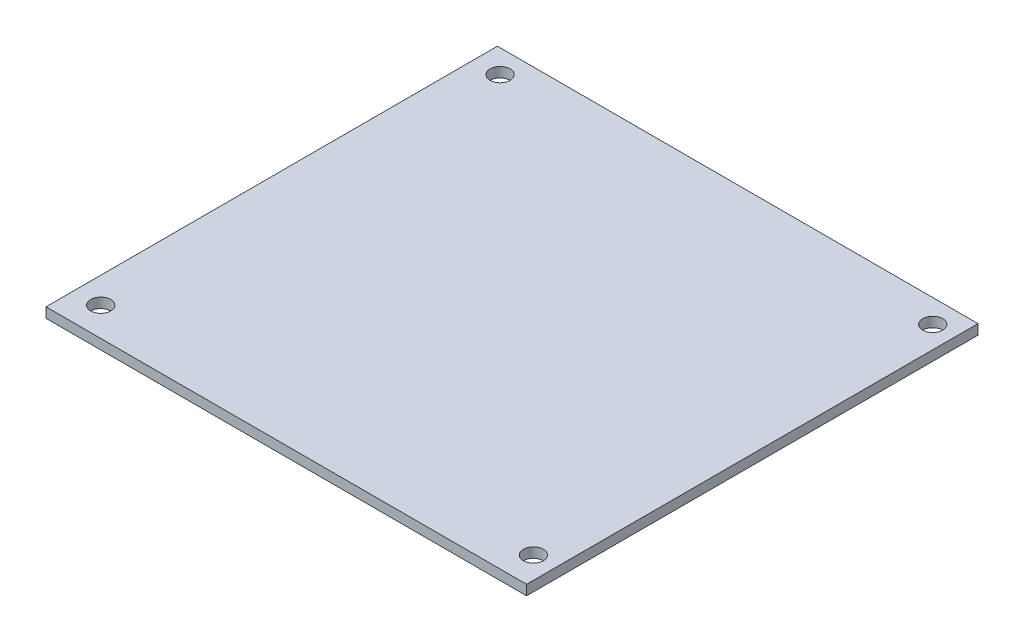
ISO-10303-21;
HEADER;
FILE_DESCRIPTION(('STEP AP214'),'2;1');
FILE_NAME('part.step','',(''),(''),'','','');
FILE_SCHEMA(('AUTOMOTIVE_DESIGN { 1 0 10303 214 1 1 1 1 }'));
ENDSEC;
DATA;
#1=APPLICATION_CONTEXT('core data for automotive mechanical design processes');
#2=APPLICATION_PROTOCOL_DEFINITION('international standard','automotive_design',2000,#1);
#3=PRODUCT_CONTEXT('',#1,'mechanical');
#4=PRODUCT('Part','Part','',(#3));
#5=PRODUCT_RELATED_PRODUCT_CATEGORY('part','',(#4));
#6=PRODUCT_DEFINITION_FORMATION('','',#4);
#7=PRODUCT_DEFINITION_CONTEXT('part definition',#1,'design');
#8=PRODUCT_DEFINITION('design','',#6,#7);
#9=PRODUCT_DEFINITION_SHAPE('','',#8);
#10=(LENGTH_UNIT() NAMED_UNIT(*) SI_UNIT(.MILLI.,.METRE.));
#11=(NAMED_UNIT(*) PLANE_ANGLE_UNIT() SI_UNIT($,.RADIAN.));
#12=(NAMED_UNIT(*) SI_UNIT($,.STERADIAN.) SOLID_ANGLE_UNIT());
#13=UNCERTAINTY_MEASURE_WITH_UNIT(LENGTH_MEASURE(1.E-05),#10,'distance_accuracy_value','');
#14=(GEOMETRIC_REPRESENTATION_CONTEXT(3) GLOBAL_UNCERTAINTY_ASSIGNED_CONTEXT((#13)) GLOBAL_UNIT_ASSIGNED_CONTEXT((#10,
#11,#12)) REPRESENTATION_CONTEXT('',''));
#15=CARTESIAN_POINT('',(0.,0.,0.));
#16=DIRECTION('',(0.,0.,1.));
#17=DIRECTION('',(1.,0.,0.));
#18=AXIS2_PLACEMENT_3D('',#15,#16,#17);
#19=CARTESIAN_POINT('',(0.,1.5,0.));
#20=DIRECTION('',(0.,1.,0.));
#21=DIRECTION('',(0.,0.,1.));
#22=AXIS2_PLACEMENT_3D('',#19,#20,#21);
#23=PLANE('',#22);
#24=CARTESIAN_POINT('',(-32.2,1.5,29.59));
#25=DIRECTION('',(0.,1.,0.));
#26=DIRECTION('',(0.,0.,1.));
#27=AXIS2_PLACEMENT_3D('',#24,#25,#26);
#28=CIRCLE('',#27,1.5);
#29=CARTESIAN_POINT('',(-32.2,1.5,31.09));
#30=VERTEX_POINT('',#29);
#31=EDGE_CURVE('E178',#30,#30,#28,.T.);
#32=ORIENTED_EDGE('',*,*,#31,.F.);
#33=EDGE_LOOP('',(#32));
#34=FACE_BOUND('',#33,.T.);
#35=CARTESIAN_POINT('',(32.8,1.5,-30.41));
#36=DIRECTION('',(0.,1.,0.));
#37=DIRECTION('',(0.,0.,1.));
#38=AXIS2_PLACEMENT_3D('',#35,#36,#37);
#39=CIRCLE('',#38,1.5);
#40=CARTESIAN_POINT('',(32.8,1.5,-28.91));
#41=VERTEX_POINT('',#40);
#42=EDGE_CURVE('E159',#41,#41,#39,.T.);
#43=ORIENTED_EDGE('',*,*,#42,.F.);
#44=EDGE_LOOP('',(#43));
#45=FACE_BOUND('',#44,.T.);
#46=DIRECTION('',(0.,0.,1.));
#47=VECTOR('',#46,1.);
#48=CARTESIAN_POINT('',(-36.1,1.5,-33.91));
#49=LINE('',#48,#47);
#50=CARTESIAN_POINT('',(-36.1,1.5,-33.91));
#51=VERTEX_POINT('',#50);
#52=CARTESIAN_POINT('',(-36.1,1.5,33.91));
#53=VERTEX_POINT('',#52);
#54=EDGE_CURVE('E143',#51,#53,#49,.T.);
#55=ORIENTED_EDGE('',*,*,#54,.T.);
#56=DIRECTION('',(1.,0.,0.));
#57=VECTOR('',#56,1.);
#58=CARTESIAN_POINT('',(-36.1,1.5,33.91));
#59=LINE('',#58,#57);
#60=CARTESIAN_POINT('',(36.1,1.5,33.91));
#61=VERTEX_POINT('',#60);
#62=EDGE_CURVE('E135',#53,#61,#59,.T.);
#63=ORIENTED_EDGE('',*,*,#62,.T.);
#64=DIRECTION('',(0.,0.,1.));
#65=VECTOR('',#64,1.);
#66=CARTESIAN_POINT('',(36.1,1.5,-33.91));
#67=LINE('',#66,#65);
#68=CARTESIAN_POINT('',(36.1,1.5,-33.91));
#69=VERTEX_POINT('',#68);
#70=EDGE_CURVE('E142',#69,#61,#67,.T.);
#71=ORIENTED_EDGE('',*,*,#70,.F.);
#72=DIRECTION('',(1.,0.,0.));
#73=VECTOR('',#72,1.);
#74=CARTESIAN_POINT('',(-36.1,1.5,-33.91));
#75=LINE('',#74,#73);
#76=EDGE_CURVE('E152',#51,#69,#75,.T.);
#77=ORIENTED_EDGE('',*,*,#76,.F.);
#78=EDGE_LOOP('',(#55,#63,#71,#77));
#79=FACE_BOUND('',#78,.T.);
#80=CARTESIAN_POINT('',(-32.2,1.5,-30.41));
#81=DIRECTION('',(0.,1.,0.));
#82=DIRECTION('',(0.,0.,1.));
#83=AXIS2_PLACEMENT_3D('',#80,#81,#82);
#84=CIRCLE('',#83,1.5);
#85=CARTESIAN_POINT('',(-32.2,1.5,-28.91));
#86=VERTEX_POINT('',#85);
#87=EDGE_CURVE('E172',#86,#86,#84,.T.);
#88=ORIENTED_EDGE('',*,*,#87,.F.);
#89=EDGE_LOOP('',(#88));
#90=FACE_BOUND('',#89,.T.);
#91=CARTESIAN_POINT('',(32.8,1.5,29.59));
#92=DIRECTION('',(0.,1.,0.));
#93=DIRECTION('',(0.,0.,1.));
#94=AXIS2_PLACEMENT_3D('',#91,#92,#93);
#95=CIRCLE('',#94,1.5);
#96=CARTESIAN_POINT('',(32.8,1.5,31.09));
#97=VERTEX_POINT('',#96);
#98=EDGE_CURVE('E184',#97,#97,#95,.T.);
#99=ORIENTED_EDGE('',*,*,#98,.F.);
#100=EDGE_LOOP('',(#99));
#101=FACE_BOUND('',#100,.T.);
#102=ADVANCED_FACE('F93',(#34,#45,#79,#90,#101),#23,.T.);
#103=CARTESIAN_POINT('',(0.,0.,0.));
#104=DIRECTION('',(0.,1.,0.));
#105=DIRECTION('',(0.,0.,1.));
#106=AXIS2_PLACEMENT_3D('',#103,#104,#105);
#107=PLANE('',#106);
#108=CARTESIAN_POINT('',(32.8,0.,29.59));
#109=DIRECTION('',(0.,1.,0.));
#110=DIRECTION('',(0.,0.,1.));
#111=AXIS2_PLACEMENT_3D('',#108,#109,#110);
#112=CIRCLE('',#111,1.5);
#113=CARTESIAN_POINT('',(32.8,0.,31.09));
#114=VERTEX_POINT('',#113);
#115=EDGE_CURVE('E187',#114,#114,#112,.T.);
#116=ORIENTED_EDGE('',*,*,#115,.T.);
#117=EDGE_LOOP('',(#116));
#118=FACE_BOUND('',#117,.T.);
#119=CARTESIAN_POINT('',(-32.2,0.,29.59));
#120=DIRECTION('',(0.,1.,0.));
#121=DIRECTION('',(0.,0.,1.));
#122=AXIS2_PLACEMENT_3D('',#119,#120,#121);
#123=CIRCLE('',#122,1.5);
#124=CARTESIAN_POINT('',(-32.2,0.,31.09));
#125=VERTEX_POINT('',#124);
#126=EDGE_CURVE('E181',#125,#125,#123,.T.);
#127=ORIENTED_EDGE('',*,*,#126,.T.);
#128=EDGE_LOOP('',(#127));
#129=FACE_BOUND('',#128,.T.);
#130=CARTESIAN_POINT('',(-32.2,0.,-30.41));
#131=DIRECTION('',(0.,1.,0.));
#132=DIRECTION('',(0.,0.,1.));
#133=AXIS2_PLACEMENT_3D('',#130,#131,#132);
#134=CIRCLE('',#133,1.5);
#135=CARTESIAN_POINT('',(-32.2,0.,-28.91));
#136=VERTEX_POINT('',#135);
#137=EDGE_CURVE('E175',#136,#136,#134,.T.);
#138=ORIENTED_EDGE('',*,*,#137,.T.);
#139=EDGE_LOOP('',(#138));
#140=FACE_BOUND('',#139,.T.);
#141=CARTESIAN_POINT('',(32.8,0.,-30.41));
#142=DIRECTION('',(0.,1.,0.));
#143=DIRECTION('',(0.,0.,1.));
#144=AXIS2_PLACEMENT_3D('',#141,#142,#143);
#145=CIRCLE('',#144,1.5);
#146=CARTESIAN_POINT('',(32.8,0.,-28.91));
#147=VERTEX_POINT('',#146);
#148=EDGE_CURVE('E169',#147,#147,#145,.T.);
#149=ORIENTED_EDGE('',*,*,#148,.T.);
#150=EDGE_LOOP('',(#149));
#151=FACE_BOUND('',#150,.T.);
#152=DIRECTION('',(0.,0.,1.));
#153=VECTOR('',#152,1.);
#154=CARTESIAN_POINT('',(-36.1,0.,-33.91));
#155=LINE('',#154,#153);
#156=CARTESIAN_POINT('',(-36.1,0.,-33.91));
#157=VERTEX_POINT('',#156);
#158=CARTESIAN_POINT('',(-36.1,0.,33.91));
#159=VERTEX_POINT('',#158);
#160=EDGE_CURVE('E157',#157,#159,#155,.T.);
#161=ORIENTED_EDGE('',*,*,#160,.F.);
#162=DIRECTION('',(1.,0.,0.));
#163=VECTOR('',#162,1.);
#164=CARTESIAN_POINT('',(-36.1,0.,-33.91));
#165=LINE('',#164,#163);
#166=CARTESIAN_POINT('',(36.1,0.,-33.91));
#167=VERTEX_POINT('',#166);
#168=EDGE_CURVE('E163',#157,#167,#165,.T.);
#169=ORIENTED_EDGE('',*,*,#168,.T.);
#170=DIRECTION('',(0.,0.,1.));
#171=VECTOR('',#170,1.);
#172=CARTESIAN_POINT('',(36.1,0.,-33.91));
#173=LINE('',#172,#171);
#174=CARTESIAN_POINT('',(36.1,0.,33.91));
#175=VERTEX_POINT('',#174);
#176=EDGE_CURVE('E161',#167,#175,#173,.T.);
#177=ORIENTED_EDGE('',*,*,#176,.T.);
#178=DIRECTION('',(1.,0.,0.));
#179=VECTOR('',#178,1.);
#180=CARTESIAN_POINT('',(-36.1,0.,33.91));
#181=LINE('',#180,#179);
#182=EDGE_CURVE('E148',#159,#175,#181,.T.);
#183=ORIENTED_EDGE('',*,*,#182,.F.);
#184=EDGE_LOOP('',(#161,#169,#177,#183));
#185=FACE_BOUND('',#184,.T.);
#186=ADVANCED_FACE('F197',(#118,#129,#140,#151,#185),#107,.F.);
#187=CARTESIAN_POINT('',(-36.1,1.5,-33.91));
#188=DIRECTION('',(1.,0.,0.));
#189=DIRECTION('',(0.,0.,-1.));
#190=AXIS2_PLACEMENT_3D('',#187,#188,#189);
#191=PLANE('',#190);
#192=ORIENTED_EDGE('',*,*,#160,.T.);
#193=DIRECTION('',(0.,-1.,0.));
#194=VECTOR('',#193,1.);
#195=CARTESIAN_POINT('',(-36.1,1.5,33.91));
#196=LINE('',#195,#194);
#197=EDGE_CURVE('E12',#53,#159,#196,.T.);
#198=ORIENTED_EDGE('',*,*,#197,.F.);
#199=ORIENTED_EDGE('',*,*,#54,.F.);
#200=DIRECTION('',(0.,-1.,0.));
#201=VECTOR('',#200,1.);
#202=CARTESIAN_POINT('',(-36.1,1.5,-33.91));
#203=LINE('',#202,#201);
#204=EDGE_CURVE('E110',#51,#157,#203,.T.);
#205=ORIENTED_EDGE('',*,*,#204,.T.);
#206=EDGE_LOOP('',(#192,#198,#199,#205));
#207=FACE_BOUND('',#206,.T.);
#208=ADVANCED_FACE('F95',(#207),#191,.F.);
#209=CARTESIAN_POINT('',(-36.1,1.5,33.91));
#210=DIRECTION('',(0.,0.,-1.));
#211=DIRECTION('',(-1.,0.,0.));
#212=AXIS2_PLACEMENT_3D('',#209,#210,#211);
#213=PLANE('',#212);
#214=ORIENTED_EDGE('',*,*,#182,.T.);
#215=DIRECTION('',(0.,-1.,0.));
#216=VECTOR('',#215,1.);
#217=CARTESIAN_POINT('',(36.1,1.5,33.91));
#218=LINE('',#217,#216);
#219=EDGE_CURVE('E102',#61,#175,#218,.T.);
#220=ORIENTED_EDGE('',*,*,#219,.F.);
#221=ORIENTED_EDGE('',*,*,#62,.F.);
#222=ORIENTED_EDGE('',*,*,#197,.T.);
#223=EDGE_LOOP('',(#214,#220,#221,#222));
#224=FACE_BOUND('',#223,.T.);
#225=ADVANCED_FACE('F147',(#224),#213,.F.);
#226=CARTESIAN_POINT('',(36.1,1.5,-33.91));
#227=DIRECTION('',(1.,0.,0.));
#228=DIRECTION('',(0.,0.,-1.));
#229=AXIS2_PLACEMENT_3D('',#226,#227,#228);
#230=PLANE('',#229);
#231=ORIENTED_EDGE('',*,*,#176,.F.);
#232=DIRECTION('',(0.,-1.,0.));
#233=VECTOR('',#232,1.);
#234=CARTESIAN_POINT('',(36.1,1.5,-33.91));
#235=LINE('',#234,#233);
#236=EDGE_CURVE('E124',#69,#167,#235,.T.);
#237=ORIENTED_EDGE('',*,*,#236,.F.);
#238=ORIENTED_EDGE('',*,*,#70,.T.);
#239=ORIENTED_EDGE('',*,*,#219,.T.);
#240=EDGE_LOOP('',(#231,#237,#238,#239));
#241=FACE_BOUND('',#240,.T.);
#242=ADVANCED_FACE('F151',(#241),#230,.T.);
#243=CARTESIAN_POINT('',(-36.1,1.5,-33.91));
#244=DIRECTION('',(0.,0.,-1.));
#245=DIRECTION('',(-1.,0.,0.));
#246=AXIS2_PLACEMENT_3D('',#243,#244,#245);
#247=PLANE('',#246);
#248=ORIENTED_EDGE('',*,*,#168,.F.);
#249=ORIENTED_EDGE('',*,*,#204,.F.);
#250=ORIENTED_EDGE('',*,*,#76,.T.);
#251=ORIENTED_EDGE('',*,*,#236,.T.);
#252=EDGE_LOOP('',(#248,#249,#250,#251));
#253=FACE_BOUND('',#252,.T.);
#254=ADVANCED_FACE('F211',(#253),#247,.T.);
#255=CARTESIAN_POINT('',(32.8,1.5,-30.41));
#256=DIRECTION('',(0.,-1.,0.));
#257=DIRECTION('',(0.,0.,-1.));
#258=AXIS2_PLACEMENT_3D('',#255,#256,#257);
#259=CYLINDRICAL_SURFACE('',#258,1.5);
#260=ORIENTED_EDGE('',*,*,#42,.T.);
#261=EDGE_LOOP('',(#260));
#262=FACE_BOUND('',#261,.T.);
#263=ORIENTED_EDGE('',*,*,#148,.F.);
#264=EDGE_LOOP('',(#263));
#265=FACE_BOUND('',#264,.T.);
#266=ADVANCED_FACE('F208',(#262,#265),#259,.F.);
#267=CARTESIAN_POINT('',(-32.2,1.5,-30.41));
#268=DIRECTION('',(0.,-1.,0.));
#269=DIRECTION('',(0.,0.,-1.));
#270=AXIS2_PLACEMENT_3D('',#267,#268,#269);
#271=CYLINDRICAL_SURFACE('',#270,1.5);
#272=ORIENTED_EDGE('',*,*,#87,.T.);
#273=EDGE_LOOP('',(#272));
#274=FACE_BOUND('',#273,.T.);
#275=ORIENTED_EDGE('',*,*,#137,.F.);
#276=EDGE_LOOP('',(#275));
#277=FACE_BOUND('',#276,.T.);
#278=ADVANCED_FACE('F247',(#274,#277),#271,.F.);
#279=CARTESIAN_POINT('',(-32.2,1.5,29.59));
#280=DIRECTION('',(0.,-1.,0.));
#281=DIRECTION('',(0.,0.,-1.));
#282=AXIS2_PLACEMENT_3D('',#279,#280,#281);
#283=CYLINDRICAL_SURFACE('',#282,1.5);
#284=ORIENTED_EDGE('',*,*,#31,.T.);
#285=EDGE_LOOP('',(#284));
#286=FACE_BOUND('',#285,.T.);
#287=ORIENTED_EDGE('',*,*,#126,.F.);
#288=EDGE_LOOP('',(#287));
#289=FACE_BOUND('',#288,.T.);
#290=ADVANCED_FACE('F238',(#286,#289),#283,.F.);
#291=CARTESIAN_POINT('',(32.8,1.5,29.59));
#292=DIRECTION('',(0.,-1.,0.));
#293=DIRECTION('',(0.,0.,-1.));
#294=AXIS2_PLACEMENT_3D('',#291,#292,#293);
#295=CYLINDRICAL_SURFACE('',#294,1.5);
#296=ORIENTED_EDGE('',*,*,#98,.T.);
#297=EDGE_LOOP('',(#296));
#298=FACE_BOUND('',#297,.T.);
#299=ORIENTED_EDGE('',*,*,#115,.F.);
#300=EDGE_LOOP('',(#299));
#301=FACE_BOUND('',#300,.T.);
#302=ADVANCED_FACE('F193',(#298,#301),#295,.F.);
#303=CLOSED_SHELL('',(#102,#186,#208,#225,#242,#254,#266,#278,#290,#302));
#304=MANIFOLD_SOLID_BREP('B2',#303);
#305=ADVANCED_BREP_SHAPE_REPRESENTATION('',(#18,#304),#14);
#306=SHAPE_DEFINITION_REPRESENTATION(#9,#305);
ENDSEC;
END-ISO-10303-21;
